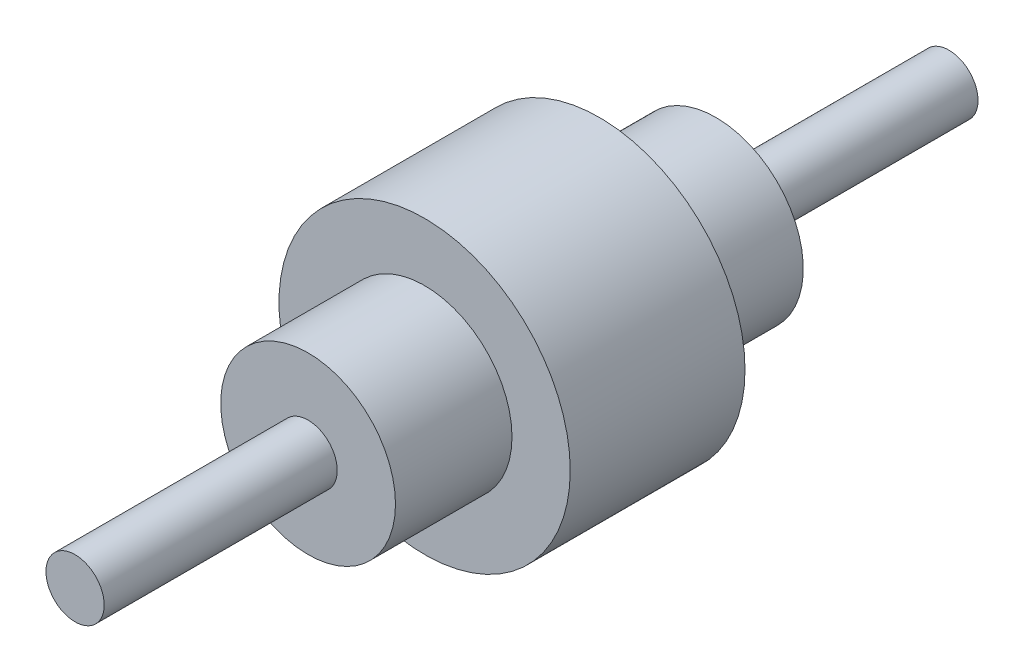
ISO-10303-21;
HEADER;
FILE_DESCRIPTION(('STEP AP214'),'2;1');
FILE_NAME('part.step','',(''),(''),'','','');
FILE_SCHEMA(('AUTOMOTIVE_DESIGN { 1 0 10303 214 1 1 1 1 }'));
ENDSEC;
DATA;
#1=APPLICATION_CONTEXT('core data for automotive mechanical design processes');
#2=APPLICATION_PROTOCOL_DEFINITION('international standard','automotive_design',2000,#1);
#3=PRODUCT_CONTEXT('',#1,'mechanical');
#4=PRODUCT('Part','Part','',(#3));
#5=PRODUCT_RELATED_PRODUCT_CATEGORY('part','',(#4));
#6=PRODUCT_DEFINITION_FORMATION('','',#4);
#7=PRODUCT_DEFINITION_CONTEXT('part definition',#1,'design');
#8=PRODUCT_DEFINITION('design','',#6,#7);
#9=PRODUCT_DEFINITION_SHAPE('','',#8);
#10=(LENGTH_UNIT() NAMED_UNIT(*) SI_UNIT(.MILLI.,.METRE.));
#11=(NAMED_UNIT(*) PLANE_ANGLE_UNIT() SI_UNIT($,.RADIAN.));
#12=(NAMED_UNIT(*) SI_UNIT($,.STERADIAN.) SOLID_ANGLE_UNIT());
#13=UNCERTAINTY_MEASURE_WITH_UNIT(LENGTH_MEASURE(1.E-05),#10,'distance_accuracy_value','');
#14=(GEOMETRIC_REPRESENTATION_CONTEXT(3) GLOBAL_UNCERTAINTY_ASSIGNED_CONTEXT((#13)) GLOBAL_UNIT_ASSIGNED_CONTEXT((#10,
#11,#12)) REPRESENTATION_CONTEXT('',''));
#15=CARTESIAN_POINT('',(0.,0.,0.));
#16=DIRECTION('',(0.,0.,1.));
#17=DIRECTION('',(1.,0.,0.));
#18=AXIS2_PLACEMENT_3D('',#15,#16,#17);
#19=CARTESIAN_POINT('',(0.,0.,1524.));
#20=DIRECTION('',(0.,0.,-1.));
#21=DIRECTION('',(-1.,0.,0.));
#22=AXIS2_PLACEMENT_3D('',#19,#20,#21);
#23=CYLINDRICAL_SURFACE('',#22,1270.);
#24=CARTESIAN_POINT('',(0.,0.,1524.));
#25=DIRECTION('',(0.,0.,1.));
#26=DIRECTION('',(1.,0.,0.));
#27=AXIS2_PLACEMENT_3D('',#24,#25,#26);
#28=CIRCLE('',#27,1270.);
#29=CARTESIAN_POINT('',(1270.,0.,1524.));
#30=VERTEX_POINT('',#29);
#31=EDGE_CURVE('E61',#30,#30,#28,.T.);
#32=ORIENTED_EDGE('',*,*,#31,.F.);
#33=EDGE_LOOP('',(#32));
#34=FACE_BOUND('',#33,.T.);
#35=CARTESIAN_POINT('',(0.,0.,0.));
#36=DIRECTION('',(0.,0.,1.));
#37=DIRECTION('',(1.,0.,0.));
#38=AXIS2_PLACEMENT_3D('',#35,#36,#37);
#39=CIRCLE('',#38,1270.);
#40=CARTESIAN_POINT('',(1270.,0.,0.));
#41=VERTEX_POINT('',#40);
#42=EDGE_CURVE('E34',#41,#41,#39,.T.);
#43=ORIENTED_EDGE('',*,*,#42,.T.);
#44=EDGE_LOOP('',(#43));
#45=FACE_BOUND('',#44,.T.);
#46=ADVANCED_FACE('F31',(#34,#45),#23,.T.);
#47=CARTESIAN_POINT('',(0.,0.,1524.));
#48=DIRECTION('',(0.,0.,1.));
#49=DIRECTION('',(1.,0.,0.));
#50=AXIS2_PLACEMENT_3D('',#47,#48,#49);
#51=PLANE('',#50);
#52=CARTESIAN_POINT('',(0.,0.,1524.));
#53=DIRECTION('',(0.,0.,1.));
#54=DIRECTION('',(1.,0.,0.));
#55=AXIS2_PLACEMENT_3D('',#52,#53,#54);
#56=CIRCLE('',#55,762.);
#57=CARTESIAN_POINT('',(762.,0.,1524.));
#58=VERTEX_POINT('',#57);
#59=EDGE_CURVE('E57',#58,#58,#56,.T.);
#60=ORIENTED_EDGE('',*,*,#59,.F.);
#61=EDGE_LOOP('',(#60));
#62=FACE_BOUND('',#61,.T.);
#63=ORIENTED_EDGE('',*,*,#31,.T.);
#64=EDGE_LOOP('',(#63));
#65=FACE_BOUND('',#64,.T.);
#66=ADVANCED_FACE('F72',(#62,#65),#51,.T.);
#67=CARTESIAN_POINT('',(0.,0.,0.));
#68=DIRECTION('',(0.,0.,1.));
#69=DIRECTION('',(1.,0.,0.));
#70=AXIS2_PLACEMENT_3D('',#67,#68,#69);
#71=PLANE('',#70);
#72=CARTESIAN_POINT('',(0.,0.,0.));
#73=DIRECTION('',(0.,0.,-1.));
#74=DIRECTION('',(-1.,0.,0.));
#75=AXIS2_PLACEMENT_3D('',#72,#73,#74);
#76=CIRCLE('',#75,762.);
#77=CARTESIAN_POINT('',(-762.,0.,0.));
#78=VERTEX_POINT('',#77);
#79=EDGE_CURVE('E38',#78,#78,#76,.T.);
#80=ORIENTED_EDGE('',*,*,#79,.F.);
#81=EDGE_LOOP('',(#80));
#82=FACE_BOUND('',#81,.T.);
#83=ORIENTED_EDGE('',*,*,#42,.F.);
#84=EDGE_LOOP('',(#83));
#85=FACE_BOUND('',#84,.T.);
#86=ADVANCED_FACE('F69',(#82,#85),#71,.F.);
#87=CARTESIAN_POINT('',(0.,0.,2540.));
#88=DIRECTION('',(0.,0.,-1.));
#89=DIRECTION('',(-1.,0.,0.));
#90=AXIS2_PLACEMENT_3D('',#87,#88,#89);
#91=CYLINDRICAL_SURFACE('',#90,762.);
#92=CARTESIAN_POINT('',(0.,0.,2540.));
#93=DIRECTION('',(0.,0.,1.));
#94=DIRECTION('',(1.,0.,0.));
#95=AXIS2_PLACEMENT_3D('',#92,#93,#94);
#96=CIRCLE('',#95,762.);
#97=CARTESIAN_POINT('',(762.,0.,2540.));
#98=VERTEX_POINT('',#97);
#99=EDGE_CURVE('E54',#98,#98,#96,.T.);
#100=ORIENTED_EDGE('',*,*,#99,.F.);
#101=EDGE_LOOP('',(#100));
#102=FACE_BOUND('',#101,.T.);
#103=ORIENTED_EDGE('',*,*,#59,.T.);
#104=EDGE_LOOP('',(#103));
#105=FACE_BOUND('',#104,.T.);
#106=ADVANCED_FACE('F71',(#102,#105),#91,.T.);
#107=CARTESIAN_POINT('',(0.,0.,2540.));
#108=DIRECTION('',(0.,0.,1.));
#109=DIRECTION('',(1.,0.,0.));
#110=AXIS2_PLACEMENT_3D('',#107,#108,#109);
#111=PLANE('',#110);
#112=CARTESIAN_POINT('',(0.,0.,2540.));
#113=DIRECTION('',(0.,0.,1.));
#114=DIRECTION('',(1.,0.,0.));
#115=AXIS2_PLACEMENT_3D('',#112,#113,#114);
#116=CIRCLE('',#115,254.);
#117=CARTESIAN_POINT('',(254.,0.,2540.));
#118=VERTEX_POINT('',#117);
#119=EDGE_CURVE('E43',#118,#118,#116,.T.);
#120=ORIENTED_EDGE('',*,*,#119,.F.);
#121=EDGE_LOOP('',(#120));
#122=FACE_BOUND('',#121,.T.);
#123=ORIENTED_EDGE('',*,*,#99,.T.);
#124=EDGE_LOOP('',(#123));
#125=FACE_BOUND('',#124,.T.);
#126=ADVANCED_FACE('F78',(#122,#125),#111,.T.);
#127=CARTESIAN_POINT('',(0.,0.,4572.));
#128=DIRECTION('',(0.,0.,-1.));
#129=DIRECTION('',(-1.,0.,0.));
#130=AXIS2_PLACEMENT_3D('',#127,#128,#129);
#131=CYLINDRICAL_SURFACE('',#130,254.);
#132=CARTESIAN_POINT('',(0.,0.,4572.));
#133=DIRECTION('',(0.,0.,1.));
#134=DIRECTION('',(1.,0.,0.));
#135=AXIS2_PLACEMENT_3D('',#132,#133,#134);
#136=CIRCLE('',#135,254.);
#137=CARTESIAN_POINT('',(254.,0.,4572.));
#138=VERTEX_POINT('',#137);
#139=EDGE_CURVE('E50',#138,#138,#136,.T.);
#140=ORIENTED_EDGE('',*,*,#139,.F.);
#141=EDGE_LOOP('',(#140));
#142=FACE_BOUND('',#141,.T.);
#143=ORIENTED_EDGE('',*,*,#119,.T.);
#144=EDGE_LOOP('',(#143));
#145=FACE_BOUND('',#144,.T.);
#146=ADVANCED_FACE('F108',(#142,#145),#131,.T.);
#147=CARTESIAN_POINT('',(0.,0.,4572.));
#148=DIRECTION('',(0.,0.,1.));
#149=DIRECTION('',(1.,0.,0.));
#150=AXIS2_PLACEMENT_3D('',#147,#148,#149);
#151=PLANE('',#150);
#152=ORIENTED_EDGE('',*,*,#139,.T.);
#153=EDGE_LOOP('',(#152));
#154=FACE_BOUND('',#153,.T.);
#155=ADVANCED_FACE('F118',(#154),#151,.T.);
#156=CARTESIAN_POINT('',(0.,0.,-1016.));
#157=DIRECTION('',(0.,0.,1.));
#158=DIRECTION('',(1.,0.,0.));
#159=AXIS2_PLACEMENT_3D('',#156,#157,#158);
#160=CYLINDRICAL_SURFACE('',#159,762.);
#161=CARTESIAN_POINT('',(0.,0.,-1016.));
#162=DIRECTION('',(0.,0.,-1.));
#163=DIRECTION('',(-1.,0.,0.));
#164=AXIS2_PLACEMENT_3D('',#161,#162,#163);
#165=CIRCLE('',#164,762.);
#166=CARTESIAN_POINT('',(-762.,0.,-1016.));
#167=VERTEX_POINT('',#166);
#168=EDGE_CURVE('E48',#167,#167,#165,.T.);
#169=ORIENTED_EDGE('',*,*,#168,.F.);
#170=EDGE_LOOP('',(#169));
#171=FACE_BOUND('',#170,.T.);
#172=ORIENTED_EDGE('',*,*,#79,.T.);
#173=EDGE_LOOP('',(#172));
#174=FACE_BOUND('',#173,.T.);
#175=ADVANCED_FACE('F127',(#171,#174),#160,.T.);
#176=CARTESIAN_POINT('',(0.,0.,-1016.));
#177=DIRECTION('',(0.,0.,-1.));
#178=DIRECTION('',(-1.,0.,0.));
#179=AXIS2_PLACEMENT_3D('',#176,#177,#178);
#180=PLANE('',#179);
#181=CARTESIAN_POINT('',(0.,0.,-1016.));
#182=DIRECTION('',(0.,0.,-1.));
#183=DIRECTION('',(-1.,0.,0.));
#184=AXIS2_PLACEMENT_3D('',#181,#182,#183);
#185=CIRCLE('',#184,254.);
#186=CARTESIAN_POINT('',(-254.,0.,-1016.));
#187=VERTEX_POINT('',#186);
#188=EDGE_CURVE('E10',#187,#187,#185,.T.);
#189=ORIENTED_EDGE('',*,*,#188,.F.);
#190=EDGE_LOOP('',(#189));
#191=FACE_BOUND('',#190,.T.);
#192=ORIENTED_EDGE('',*,*,#168,.T.);
#193=EDGE_LOOP('',(#192));
#194=FACE_BOUND('',#193,.T.);
#195=ADVANCED_FACE('F141',(#191,#194),#180,.T.);
#196=CARTESIAN_POINT('',(0.,0.,-3048.));
#197=DIRECTION('',(0.,0.,1.));
#198=DIRECTION('',(1.,0.,0.));
#199=AXIS2_PLACEMENT_3D('',#196,#197,#198);
#200=CYLINDRICAL_SURFACE('',#199,254.);
#201=CARTESIAN_POINT('',(0.,0.,-3048.));
#202=DIRECTION('',(0.,0.,-1.));
#203=DIRECTION('',(-1.,0.,0.));
#204=AXIS2_PLACEMENT_3D('',#201,#202,#203);
#205=CIRCLE('',#204,254.);
#206=CARTESIAN_POINT('',(-254.,0.,-3048.));
#207=VERTEX_POINT('',#206);
#208=EDGE_CURVE('E47',#207,#207,#205,.T.);
#209=ORIENTED_EDGE('',*,*,#208,.F.);
#210=EDGE_LOOP('',(#209));
#211=FACE_BOUND('',#210,.T.);
#212=ORIENTED_EDGE('',*,*,#188,.T.);
#213=EDGE_LOOP('',(#212));
#214=FACE_BOUND('',#213,.T.);
#215=ADVANCED_FACE('F151',(#211,#214),#200,.T.);
#216=CARTESIAN_POINT('',(0.,0.,-3048.));
#217=DIRECTION('',(0.,0.,-1.));
#218=DIRECTION('',(-1.,0.,0.));
#219=AXIS2_PLACEMENT_3D('',#216,#217,#218);
#220=PLANE('',#219);
#221=ORIENTED_EDGE('',*,*,#208,.T.);
#222=EDGE_LOOP('',(#221));
#223=FACE_BOUND('',#222,.T.);
#224=ADVANCED_FACE('F161',(#223),#220,.T.);
#225=CLOSED_SHELL('',(#46,#66,#86,#106,#126,#146,#155,#175,#195,#215,#224));
#226=MANIFOLD_SOLID_BREP('B2',#225);
#227=ADVANCED_BREP_SHAPE_REPRESENTATION('',(#18,#226),#14);
#228=SHAPE_DEFINITION_REPRESENTATION(#9,#227);
ENDSEC;
END-ISO-10303-21;
